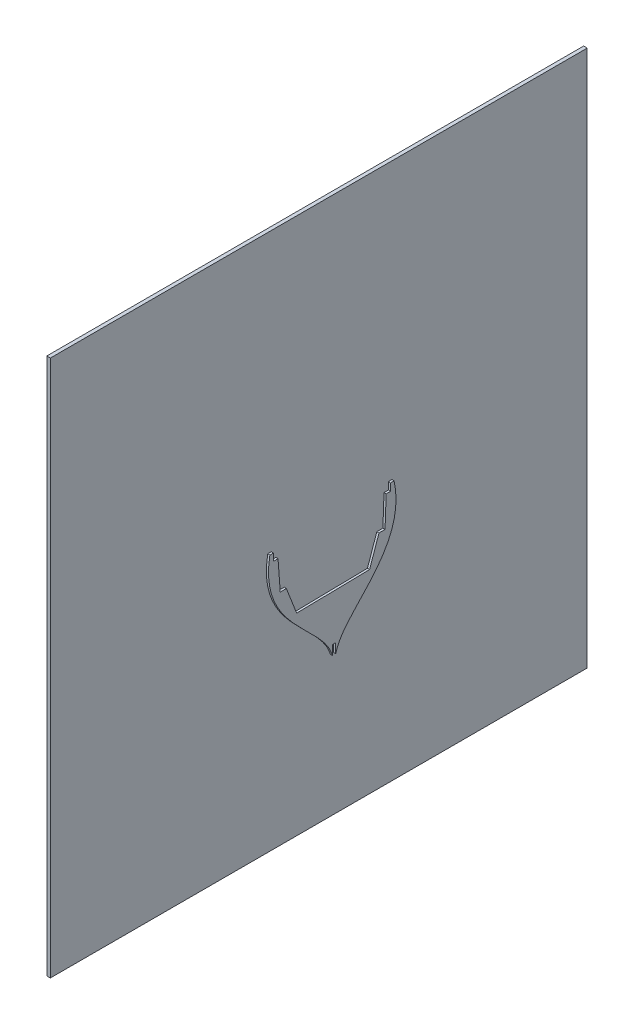
ISO-10303-21;
HEADER;
FILE_DESCRIPTION(('STEP AP214'),'2;1');
FILE_NAME('part.step','',(''),(''),'','','');
FILE_SCHEMA(('AUTOMOTIVE_DESIGN { 1 0 10303 214 1 1 1 1 }'));
ENDSEC;
DATA;
#1=APPLICATION_CONTEXT('core data for automotive mechanical design processes');
#2=APPLICATION_PROTOCOL_DEFINITION('international standard','automotive_design',2000,#1);
#3=PRODUCT_CONTEXT('',#1,'mechanical');
#4=PRODUCT('Part','Part','',(#3));
#5=PRODUCT_RELATED_PRODUCT_CATEGORY('part','',(#4));
#6=PRODUCT_DEFINITION_FORMATION('','',#4);
#7=PRODUCT_DEFINITION_CONTEXT('part definition',#1,'design');
#8=PRODUCT_DEFINITION('design','',#6,#7);
#9=PRODUCT_DEFINITION_SHAPE('','',#8);
#10=(LENGTH_UNIT() NAMED_UNIT(*) SI_UNIT(.MILLI.,.METRE.));
#11=(NAMED_UNIT(*) PLANE_ANGLE_UNIT() SI_UNIT($,.RADIAN.));
#12=(NAMED_UNIT(*) SI_UNIT($,.STERADIAN.) SOLID_ANGLE_UNIT());
#13=UNCERTAINTY_MEASURE_WITH_UNIT(LENGTH_MEASURE(1.E-05),#10,'distance_accuracy_value','');
#14=(GEOMETRIC_REPRESENTATION_CONTEXT(3) GLOBAL_UNCERTAINTY_ASSIGNED_CONTEXT((#13)) GLOBAL_UNIT_ASSIGNED_CONTEXT((#10,
#11,#12)) REPRESENTATION_CONTEXT('',''));
#15=CARTESIAN_POINT('',(0.,0.,0.));
#16=DIRECTION('',(0.,0.,1.));
#17=DIRECTION('',(1.,0.,0.));
#18=AXIS2_PLACEMENT_3D('',#15,#16,#17);
#19=CARTESIAN_POINT('',(6.,353.882778789468,179.975141307464));
#20=CARTESIAN_POINT('',(6.,157.878809233988,215.65519076964));
#21=CARTESIAN_POINT('',(6.,109.306012211339,12.0353677189194));
#22=CARTESIAN_POINT('',(6.,40.5531950083468,7.26042253036738));
#23=CARTESIAN_POINT('',(6.,0.,0.));
#24=B_SPLINE_CURVE_WITH_KNOTS('',4,(#19,#20,#21,#22,#23),.UNSPECIFIED.,.F.,.F.,(5,5),(0.,1.),.UNSPECIFIED.);
#25=DIRECTION('',(-1.,0.,0.));
#26=VECTOR('',#25,1.);
#27=SURFACE_OF_LINEAR_EXTRUSION('',#24,#26);
#28=CARTESIAN_POINT('',(0.,353.882778789468,179.975141307464));
#29=CARTESIAN_POINT('',(0.,157.878809233988,215.65519076964));
#30=CARTESIAN_POINT('',(0.,109.306012211339,12.0353677189194));
#31=CARTESIAN_POINT('',(0.,40.5531950083468,7.26042253036738));
#32=CARTESIAN_POINT('',(0.,0.,0.));
#33=B_SPLINE_CURVE_WITH_KNOTS('',4,(#28,#29,#30,#31,#32),.UNSPECIFIED.,.F.,.F.,(5,5),(0.,1.),.UNSPECIFIED.);
#34=CARTESIAN_POINT('',(0.,353.882778789468,179.975141307464));
#35=VERTEX_POINT('',#34);
#36=CARTESIAN_POINT('',(0.,22.9431478188066,4.91710052919201));
#37=VERTEX_POINT('',#36);
#38=EDGE_CURVE('E192',#35,#37,#33,.T.);
#39=ORIENTED_EDGE('',*,*,#38,.T.);
#40=DIRECTION('',(1.,0.,0.));
#41=VECTOR('',#40,1.);
#42=CARTESIAN_POINT('',(0.,22.9431478188066,4.91710052919201));
#43=LINE('',#42,#41);
#44=CARTESIAN_POINT('',(6.,22.9431478188066,4.91710052919201));
#45=VERTEX_POINT('',#44);
#46=EDGE_CURVE('E198',#37,#45,#43,.T.);
#47=ORIENTED_EDGE('',*,*,#46,.T.);
#48=CARTESIAN_POINT('',(6.,353.882778789468,179.975141307464));
#49=VERTEX_POINT('',#48);
#50=EDGE_CURVE('E232',#49,#45,#24,.T.);
#51=ORIENTED_EDGE('',*,*,#50,.F.);
#52=DIRECTION('',(-1.,0.,0.));
#53=VECTOR('',#52,1.);
#54=CARTESIAN_POINT('',(6.,353.882778789468,179.975141307464));
#55=LINE('',#54,#53);
#56=EDGE_CURVE('E188',#49,#35,#55,.T.);
#57=ORIENTED_EDGE('',*,*,#56,.T.);
#58=EDGE_LOOP('',(#39,#47,#51,#57));
#59=FACE_BOUND('',#58,.T.);
#60=ADVANCED_FACE('F45',(#59),#27,.F.);
#61=CARTESIAN_POINT('',(6.,0.,0.));
#62=CARTESIAN_POINT('',(6.,40.7895515982631,-5.78686798856676));
#63=CARTESIAN_POINT('',(6.,109.670201920761,-8.06853098987226));
#64=CARTESIAN_POINT('',(6.,165.586009065456,-209.795503557171));
#65=CARTESIAN_POINT('',(6.,360.169085770446,-167.039822400762));
#66=B_SPLINE_CURVE_WITH_KNOTS('',4,(#61,#62,#63,#64,#65),.UNSPECIFIED.,.F.,.F.,(5,5),(0.,1.),.UNSPECIFIED.);
#67=DIRECTION('',(-1.,0.,0.));
#68=VECTOR('',#67,1.);
#69=SURFACE_OF_LINEAR_EXTRUSION('',#66,#68);
#70=CARTESIAN_POINT('',(6.,23.1061862141087,-4.08289947080799));
#71=VERTEX_POINT('',#70);
#72=CARTESIAN_POINT('',(6.,360.169085770446,-167.039822400762));
#73=VERTEX_POINT('',#72);
#74=EDGE_CURVE('E128',#71,#73,#66,.T.);
#75=ORIENTED_EDGE('',*,*,#74,.F.);
#76=DIRECTION('',(1.,0.,0.));
#77=VECTOR('',#76,1.);
#78=CARTESIAN_POINT('',(0.,23.1061862141087,-4.08289947080799));
#79=LINE('',#78,#77);
#80=CARTESIAN_POINT('',(0.,23.1061862141087,-4.08289947080799));
#81=VERTEX_POINT('',#80);
#82=EDGE_CURVE('E322',#81,#71,#79,.T.);
#83=ORIENTED_EDGE('',*,*,#82,.F.);
#84=CARTESIAN_POINT('',(0.,0.,0.));
#85=CARTESIAN_POINT('',(0.,40.7895515982631,-5.78686798856676));
#86=CARTESIAN_POINT('',(0.,109.670201920761,-8.06853098987226));
#87=CARTESIAN_POINT('',(0.,165.586009065456,-209.795503557171));
#88=CARTESIAN_POINT('',(0.,360.169085770446,-167.039822400762));
#89=B_SPLINE_CURVE_WITH_KNOTS('',4,(#84,#85,#86,#87,#88),.UNSPECIFIED.,.F.,.F.,(5,5),(0.,1.),.UNSPECIFIED.);
#90=CARTESIAN_POINT('',(0.,360.169085770446,-167.039822400762));
#91=VERTEX_POINT('',#90);
#92=EDGE_CURVE('E197',#81,#91,#89,.T.);
#93=ORIENTED_EDGE('',*,*,#92,.T.);
#94=DIRECTION('',(-1.,0.,0.));
#95=VECTOR('',#94,1.);
#96=CARTESIAN_POINT('',(6.,360.169085770446,-167.039822400762));
#97=LINE('',#96,#95);
#98=EDGE_CURVE('E13',#73,#91,#97,.T.);
#99=ORIENTED_EDGE('',*,*,#98,.F.);
#100=EDGE_LOOP('',(#75,#83,#93,#99));
#101=FACE_BOUND('',#100,.T.);
#102=ADVANCED_FACE('F334',(#101),#69,.F.);
#103=CARTESIAN_POINT('',(6.,360.169085770446,-167.039822400762));
#104=DIRECTION('',(0.,-0.999835956927465,-0.0181124055536444));
#105=DIRECTION('',(0.,0.0181124055536444,-0.999835956927465));
#106=AXIS2_PLACEMENT_3D('',#103,#104,#105);
#107=PLANE('',#106);
#108=DIRECTION('',(0.,-0.0181124055536444,0.999835956927465));
#109=VECTOR('',#108,1.);
#110=CARTESIAN_POINT('',(0.,360.169085770446,-167.039822400762));
#111=LINE('',#110,#109);
#112=CARTESIAN_POINT('',(0.,359.987931997888,-157.039822400762));
#113=VERTEX_POINT('',#112);
#114=EDGE_CURVE('E205',#91,#113,#111,.T.);
#115=ORIENTED_EDGE('',*,*,#114,.T.);
#116=DIRECTION('',(-1.,0.,0.));
#117=VECTOR('',#116,1.);
#118=CARTESIAN_POINT('',(6.,359.987931997888,-157.039822400762));
#119=LINE('',#118,#117);
#120=CARTESIAN_POINT('',(6.,359.987931997888,-157.039822400762));
#121=VERTEX_POINT('',#120);
#122=EDGE_CURVE('E53',#121,#113,#119,.T.);
#123=ORIENTED_EDGE('',*,*,#122,.F.);
#124=DIRECTION('',(0.,-0.0181124055536444,0.999835956927465));
#125=VECTOR('',#124,1.);
#126=CARTESIAN_POINT('',(6.,360.169085770446,-167.039822400762));
#127=LINE('',#126,#125);
#128=EDGE_CURVE('E316',#73,#121,#127,.T.);
#129=ORIENTED_EDGE('',*,*,#128,.F.);
#130=ORIENTED_EDGE('',*,*,#98,.T.);
#131=EDGE_LOOP('',(#115,#123,#129,#130));
#132=FACE_BOUND('',#131,.T.);
#133=ADVANCED_FACE('F337',(#132),#107,.F.);
#134=CARTESIAN_POINT('',(6.,359.987931997888,-157.039822400762));
#135=DIRECTION('',(0.,0.0086060555721297,-0.999962967218031));
#136=DIRECTION('',(0.,0.999962967218031,0.0086060555721297));
#137=AXIS2_PLACEMENT_3D('',#134,#135,#136);
#138=PLANE('',#137);
#139=DIRECTION('',(0.,-0.999962967218031,-0.0086060555721297));
#140=VECTOR('',#139,1.);
#141=CARTESIAN_POINT('',(0.,359.987931997888,-157.039822400762));
#142=LINE('',#141,#140);
#143=CARTESIAN_POINT('',(0.,339.692478500137,-157.214492669951));
#144=VERTEX_POINT('',#143);
#145=EDGE_CURVE('E210',#113,#144,#142,.T.);
#146=ORIENTED_EDGE('',*,*,#145,.T.);
#147=DIRECTION('',(-1.,0.,0.));
#148=VECTOR('',#147,1.);
#149=CARTESIAN_POINT('',(6.,339.692478500137,-157.214492669951));
#150=LINE('',#149,#148);
#151=CARTESIAN_POINT('',(6.,339.692478500137,-157.214492669951));
#152=VERTEX_POINT('',#151);
#153=EDGE_CURVE('E257',#152,#144,#150,.T.);
#154=ORIENTED_EDGE('',*,*,#153,.F.);
#155=DIRECTION('',(0.,-0.999962967218031,-0.0086060555721297));
#156=VECTOR('',#155,1.);
#157=CARTESIAN_POINT('',(6.,359.987931997888,-157.039822400762));
#158=LINE('',#157,#156);
#159=EDGE_CURVE('E266',#121,#152,#158,.T.);
#160=ORIENTED_EDGE('',*,*,#159,.F.);
#161=ORIENTED_EDGE('',*,*,#122,.T.);
#162=EDGE_LOOP('',(#146,#154,#160,#161));
#163=FACE_BOUND('',#162,.T.);
#164=ADVANCED_FACE('F264',(#163),#138,.F.);
#165=CARTESIAN_POINT('',(6.,339.692478500137,-157.214492669951));
#166=DIRECTION('',(0.,-0.999835956927465,-0.0181124055536434));
#167=DIRECTION('',(0.,0.0181124055536434,-0.999835956927466));
#168=AXIS2_PLACEMENT_3D('',#165,#166,#167);
#169=PLANE('',#168);
#170=DIRECTION('',(0.,-0.0181124055536434,0.999835956927465));
#171=VECTOR('',#170,1.);
#172=CARTESIAN_POINT('',(0.,339.692478500137,-157.214492669951));
#173=LINE('',#172,#171);
#174=CARTESIAN_POINT('',(0.,339.469822373553,-144.923491304635));
#175=VERTEX_POINT('',#174);
#176=EDGE_CURVE('E212',#144,#175,#173,.T.);
#177=ORIENTED_EDGE('',*,*,#176,.T.);
#178=DIRECTION('',(-1.,0.,0.));
#179=VECTOR('',#178,1.);
#180=CARTESIAN_POINT('',(6.,339.469822373553,-144.923491304635));
#181=LINE('',#180,#179);
#182=CARTESIAN_POINT('',(6.,339.469822373553,-144.923491304635));
#183=VERTEX_POINT('',#182);
#184=EDGE_CURVE('E254',#183,#175,#181,.T.);
#185=ORIENTED_EDGE('',*,*,#184,.F.);
#186=DIRECTION('',(0.,-0.0181124055536434,0.999835956927465));
#187=VECTOR('',#186,1.);
#188=CARTESIAN_POINT('',(6.,339.692478500137,-157.214492669951));
#189=LINE('',#188,#187);
#190=EDGE_CURVE('E287',#152,#183,#189,.T.);
#191=ORIENTED_EDGE('',*,*,#190,.F.);
#192=ORIENTED_EDGE('',*,*,#153,.T.);
#193=EDGE_LOOP('',(#177,#185,#191,#192));
#194=FACE_BOUND('',#193,.T.);
#195=ADVANCED_FACE('F278',(#194),#169,.F.);
#196=CARTESIAN_POINT('',(6.,339.469822373553,-144.923491304635));
#197=DIRECTION('',(0.,-0.0367280694330064,-0.999325296845689));
#198=DIRECTION('',(0.,0.999325296845689,-0.0367280694330064));
#199=AXIS2_PLACEMENT_3D('',#196,#197,#198);
#200=PLANE('',#199);
#201=DIRECTION('',(0.,-0.999325296845689,0.0367280694330064));
#202=VECTOR('',#201,1.);
#203=CARTESIAN_POINT('',(0.,339.469822373553,-144.923491304635));
#204=LINE('',#203,#202);
#205=CARTESIAN_POINT('',(0.,255.190482282768,-141.825983952031));
#206=VERTEX_POINT('',#205);
#207=EDGE_CURVE('E214',#175,#206,#204,.T.);
#208=ORIENTED_EDGE('',*,*,#207,.T.);
#209=DIRECTION('',(-1.,0.,0.));
#210=VECTOR('',#209,1.);
#211=CARTESIAN_POINT('',(6.,255.190482282768,-141.825983952031));
#212=LINE('',#211,#210);
#213=CARTESIAN_POINT('',(6.,255.190482282768,-141.825983952031));
#214=VERTEX_POINT('',#213);
#215=EDGE_CURVE('E251',#214,#206,#212,.T.);
#216=ORIENTED_EDGE('',*,*,#215,.F.);
#217=DIRECTION('',(0.,-0.999325296845689,0.0367280694330064));
#218=VECTOR('',#217,1.);
#219=CARTESIAN_POINT('',(6.,339.469822373553,-144.923491304635));
#220=LINE('',#219,#218);
#221=EDGE_CURVE('E284',#183,#214,#220,.T.);
#222=ORIENTED_EDGE('',*,*,#221,.F.);
#223=ORIENTED_EDGE('',*,*,#184,.T.);
#224=EDGE_LOOP('',(#208,#216,#222,#223));
#225=FACE_BOUND('',#224,.T.);
#226=ADVANCED_FACE('F282',(#225),#200,.F.);
#227=CARTESIAN_POINT('',(6.,255.190482282768,-141.825983952031));
#228=DIRECTION('',(0.,-0.999835956927466,-0.0181124055536332));
#229=DIRECTION('',(0.,0.0181124055536332,-0.999835956927466));
#230=AXIS2_PLACEMENT_3D('',#227,#228,#229);
#231=PLANE('',#230);
#232=DIRECTION('',(0.,-0.0181124055536332,0.999835956927466));
#233=VECTOR('',#232,1.);
#234=CARTESIAN_POINT('',(0.,255.190482282768,-141.825983952031));
#235=LINE('',#234,#233);
#236=CARTESIAN_POINT('',(0.,254.88291202331,-124.847576319897));
#237=VERTEX_POINT('',#236);
#238=EDGE_CURVE('E216',#206,#237,#235,.T.);
#239=ORIENTED_EDGE('',*,*,#238,.T.);
#240=DIRECTION('',(-1.,0.,0.));
#241=VECTOR('',#240,1.);
#242=CARTESIAN_POINT('',(6.,254.88291202331,-124.847576319897));
#243=LINE('',#242,#241);
#244=CARTESIAN_POINT('',(6.,254.88291202331,-124.847576319897));
#245=VERTEX_POINT('',#244);
#246=EDGE_CURVE('E248',#245,#237,#243,.T.);
#247=ORIENTED_EDGE('',*,*,#246,.F.);
#248=DIRECTION('',(0.,-0.0181124055536332,0.999835956927466));
#249=VECTOR('',#248,1.);
#250=CARTESIAN_POINT('',(6.,255.190482282768,-141.825983952031));
#251=LINE('',#250,#249);
#252=EDGE_CURVE('E286',#214,#245,#251,.T.);
#253=ORIENTED_EDGE('',*,*,#252,.F.);
#254=ORIENTED_EDGE('',*,*,#215,.T.);
#255=EDGE_LOOP('',(#239,#247,#253,#254));
#256=FACE_BOUND('',#255,.T.);
#257=ADVANCED_FACE('F347',(#256),#231,.F.);
#258=CARTESIAN_POINT('',(6.,254.88291202331,-124.847576319897));
#259=DIRECTION('',(0.,-0.328369606899199,-0.944549311187545));
#260=DIRECTION('',(0.,0.944549311187545,-0.328369606899199));
#261=AXIS2_PLACEMENT_3D('',#258,#259,#260);
#262=PLANE('',#261);
#263=DIRECTION('',(0.,-0.944549311187545,0.328369606899199));
#264=VECTOR('',#263,1.);
#265=CARTESIAN_POINT('',(0.,254.88291202331,-124.847576319897));
#266=LINE('',#265,#264);
#267=CARTESIAN_POINT('',(0.,179.646068267811,-98.6917234536576));
#268=VERTEX_POINT('',#267);
#269=EDGE_CURVE('E218',#237,#268,#266,.T.);
#270=ORIENTED_EDGE('',*,*,#269,.T.);
#271=DIRECTION('',(-1.,0.,0.));
#272=VECTOR('',#271,1.);
#273=CARTESIAN_POINT('',(6.,179.646068267811,-98.6917234536576));
#274=LINE('',#273,#272);
#275=CARTESIAN_POINT('',(6.,179.646068267811,-98.6917234536576));
#276=VERTEX_POINT('',#275);
#277=EDGE_CURVE('E245',#276,#268,#274,.T.);
#278=ORIENTED_EDGE('',*,*,#277,.F.);
#279=DIRECTION('',(0.,-0.944549311187545,0.328369606899199));
#280=VECTOR('',#279,1.);
#281=CARTESIAN_POINT('',(6.,254.88291202331,-124.847576319897));
#282=LINE('',#281,#280);
#283=EDGE_CURVE('E289',#245,#276,#282,.T.);
#284=ORIENTED_EDGE('',*,*,#283,.F.);
#285=ORIENTED_EDGE('',*,*,#246,.T.);
#286=EDGE_LOOP('',(#270,#278,#284,#285));
#287=FACE_BOUND('',#286,.T.);
#288=ADVANCED_FACE('F350',(#287),#262,.F.);
#289=CARTESIAN_POINT('',(6.,179.646068267811,-98.6917234536576));
#290=DIRECTION('',(0.,-0.999835956927465,-0.0181124055536431));
#291=DIRECTION('',(0.,0.0181124055536431,-0.999835956927466));
#292=AXIS2_PLACEMENT_3D('',#289,#290,#291);
#293=PLANE('',#292);
#294=DIRECTION('',(0.,-0.0181124055536431,0.999835956927465));
#295=VECTOR('',#294,1.);
#296=CARTESIAN_POINT('',(0.,179.646068267811,-98.6917234536576));
#297=LINE('',#296,#295);
#298=CARTESIAN_POINT('',(0.,175.953696593009,105.133547346181));
#299=VERTEX_POINT('',#298);
#300=EDGE_CURVE('E220',#268,#299,#297,.T.);
#301=ORIENTED_EDGE('',*,*,#300,.T.);
#302=DIRECTION('',(-1.,0.,0.));
#303=VECTOR('',#302,1.);
#304=CARTESIAN_POINT('',(6.,175.953696593009,105.133547346181));
#305=LINE('',#304,#303);
#306=CARTESIAN_POINT('',(6.,175.953696593009,105.133547346181));
#307=VERTEX_POINT('',#306);
#308=EDGE_CURVE('E242',#307,#299,#305,.T.);
#309=ORIENTED_EDGE('',*,*,#308,.F.);
#310=DIRECTION('',(0.,-0.0181124055536431,0.999835956927465));
#311=VECTOR('',#310,1.);
#312=CARTESIAN_POINT('',(6.,179.646068267811,-98.6917234536576));
#313=LINE('',#312,#311);
#314=EDGE_CURVE('E295',#276,#307,#313,.T.);
#315=ORIENTED_EDGE('',*,*,#314,.F.);
#316=ORIENTED_EDGE('',*,*,#277,.T.);
#317=EDGE_LOOP('',(#301,#309,#315,#316));
#318=FACE_BOUND('',#317,.T.);
#319=ADVANCED_FACE('F354',(#318),#293,.F.);
#320=CARTESIAN_POINT('',(6.,250.193840665581,133.997232237985));
#321=DIRECTION('',(0.,-0.362364664996936,0.932036399268643));
#322=DIRECTION('',(0.,-0.932036399268644,-0.362364664996936));
#323=AXIS2_PLACEMENT_3D('',#320,#321,#322);
#324=PLANE('',#323);
#325=DIRECTION('',(0.,0.932036399268643,0.362364664996936));
#326=VECTOR('',#325,1.);
#327=CARTESIAN_POINT('',(0.,250.193840665581,133.997232237985));
#328=LINE('',#327,#326);
#329=CARTESIAN_POINT('',(0.,250.193840665581,133.997232237985));
#330=VERTEX_POINT('',#329);
#331=EDGE_CURVE('E222',#299,#330,#328,.T.);
#332=ORIENTED_EDGE('',*,*,#331,.T.);
#333=DIRECTION('',(-1.,0.,0.));
#334=VECTOR('',#333,1.);
#335=CARTESIAN_POINT('',(6.,250.193840665581,133.997232237985));
#336=LINE('',#335,#334);
#337=CARTESIAN_POINT('',(6.,250.193840665581,133.997232237985));
#338=VERTEX_POINT('',#337);
#339=EDGE_CURVE('E239',#338,#330,#336,.T.);
#340=ORIENTED_EDGE('',*,*,#339,.F.);
#341=DIRECTION('',(0.,0.932036399268643,0.362364664996936));
#342=VECTOR('',#341,1.);
#343=CARTESIAN_POINT('',(6.,250.193840665581,133.997232237985));
#344=LINE('',#343,#342);
#345=EDGE_CURVE('E297',#307,#338,#344,.T.);
#346=ORIENTED_EDGE('',*,*,#345,.F.);
#347=ORIENTED_EDGE('',*,*,#308,.T.);
#348=EDGE_LOOP('',(#332,#340,#346,#347));
#349=FACE_BOUND('',#348,.T.);
#350=ADVANCED_FACE('F358',(#349),#324,.F.);
#351=CARTESIAN_POINT('',(6.,249.886270406123,150.975639870119));
#352=DIRECTION('',(0.,-0.999835956927465,-0.0181124055536447));
#353=DIRECTION('',(0.,0.0181124055536447,-0.999835956927465));
#354=AXIS2_PLACEMENT_3D('',#351,#352,#353);
#355=PLANE('',#354);
#356=DIRECTION('',(0.,-0.0181124055536447,0.999835956927465));
#357=VECTOR('',#356,1.);
#358=CARTESIAN_POINT('',(0.,249.886270406123,150.975639870119));
#359=LINE('',#358,#357);
#360=CARTESIAN_POINT('',(0.,249.886270406123,150.975639870119));
#361=VERTEX_POINT('',#360);
#362=EDGE_CURVE('E224',#330,#361,#359,.T.);
#363=ORIENTED_EDGE('',*,*,#362,.T.);
#364=DIRECTION('',(-1.,0.,0.));
#365=VECTOR('',#364,1.);
#366=CARTESIAN_POINT('',(6.,249.886270406123,150.975639870119));
#367=LINE('',#366,#365);
#368=CARTESIAN_POINT('',(6.,249.886270406123,150.975639870119));
#369=VERTEX_POINT('',#368);
#370=EDGE_CURVE('E236',#369,#361,#367,.T.);
#371=ORIENTED_EDGE('',*,*,#370,.F.);
#372=DIRECTION('',(0.,-0.0181124055536447,0.999835956927465));
#373=VECTOR('',#372,1.);
#374=CARTESIAN_POINT('',(6.,249.886270406123,150.975639870119));
#375=LINE('',#374,#373);
#376=EDGE_CURVE('E299',#338,#369,#375,.T.);
#377=ORIENTED_EDGE('',*,*,#376,.F.);
#378=ORIENTED_EDGE('',*,*,#339,.T.);
#379=EDGE_LOOP('',(#363,#371,#377,#378));
#380=FACE_BOUND('',#379,.T.);
#381=ADVANCED_FACE('F305',(#380),#355,.F.);
#382=CARTESIAN_POINT('',(6.,333.998125053212,157.123617241952));
#383=DIRECTION('',(0.,-0.0728984031613152,0.997339371937421));
#384=DIRECTION('',(0.,-0.997339371937422,-0.0728984031613152));
#385=AXIS2_PLACEMENT_3D('',#382,#383,#384);
#386=PLANE('',#385);
#387=DIRECTION('',(0.,0.997339371937422,0.0728984031613152));
#388=VECTOR('',#387,1.);
#389=CARTESIAN_POINT('',(0.,333.998125053212,157.123617241952));
#390=LINE('',#389,#388);
#391=CARTESIAN_POINT('',(0.,333.998125053212,157.123617241952));
#392=VERTEX_POINT('',#391);
#393=EDGE_CURVE('E226',#361,#392,#390,.T.);
#394=ORIENTED_EDGE('',*,*,#393,.T.);
#395=DIRECTION('',(-1.,0.,0.));
#396=VECTOR('',#395,1.);
#397=CARTESIAN_POINT('',(6.,333.998125053212,157.123617241952));
#398=LINE('',#397,#396);
#399=CARTESIAN_POINT('',(6.,333.998125053212,157.123617241952));
#400=VERTEX_POINT('',#399);
#401=EDGE_CURVE('E183',#400,#392,#398,.T.);
#402=ORIENTED_EDGE('',*,*,#401,.F.);
#403=DIRECTION('',(0.,0.997339371937422,0.0728984031613152));
#404=VECTOR('',#403,1.);
#405=CARTESIAN_POINT('',(6.,333.998125053212,157.123617241952));
#406=LINE('',#405,#404);
#407=EDGE_CURVE('E171',#369,#400,#406,.T.);
#408=ORIENTED_EDGE('',*,*,#407,.F.);
#409=ORIENTED_EDGE('',*,*,#370,.T.);
#410=EDGE_LOOP('',(#394,#402,#408,#409));
#411=FACE_BOUND('',#410,.T.);
#412=ADVANCED_FACE('F309',(#411),#386,.F.);
#413=CARTESIAN_POINT('',(6.,333.775468926628,169.414618607268));
#414=DIRECTION('',(0.,-0.999835956927465,-0.0181124055536433));
#415=DIRECTION('',(0.,0.0181124055536433,-0.999835956927466));
#416=AXIS2_PLACEMENT_3D('',#413,#414,#415);
#417=PLANE('',#416);
#418=DIRECTION('',(0.,-0.0181124055536433,0.999835956927465));
#419=VECTOR('',#418,1.);
#420=CARTESIAN_POINT('',(0.,333.775468926628,169.414618607268));
#421=LINE('',#420,#419);
#422=CARTESIAN_POINT('',(0.,333.775468926628,169.414618607268));
#423=VERTEX_POINT('',#422);
#424=EDGE_CURVE('E180',#392,#423,#421,.T.);
#425=ORIENTED_EDGE('',*,*,#424,.T.);
#426=DIRECTION('',(-1.,0.,0.));
#427=VECTOR('',#426,1.);
#428=CARTESIAN_POINT('',(6.,333.775468926628,169.414618607268));
#429=LINE('',#428,#427);
#430=CARTESIAN_POINT('',(6.,333.775468926628,169.414618607268));
#431=VERTEX_POINT('',#430);
#432=EDGE_CURVE('E177',#431,#423,#429,.T.);
#433=ORIENTED_EDGE('',*,*,#432,.F.);
#434=DIRECTION('',(0.,-0.0181124055536433,0.999835956927465));
#435=VECTOR('',#434,1.);
#436=CARTESIAN_POINT('',(6.,333.775468926628,169.414618607268));
#437=LINE('',#436,#435);
#438=EDGE_CURVE('E163',#400,#431,#437,.T.);
#439=ORIENTED_EDGE('',*,*,#438,.F.);
#440=ORIENTED_EDGE('',*,*,#401,.T.);
#441=EDGE_LOOP('',(#425,#433,#439,#440));
#442=FACE_BOUND('',#441,.T.);
#443=ADVANCED_FACE('F178',(#442),#417,.F.);
#444=CARTESIAN_POINT('',(6.,354.063932562026,169.975141307464));
#445=DIRECTION('',(0.,-0.0276171184123859,0.999618574642646));
#446=DIRECTION('',(0.,-0.999618574642647,-0.0276171184123859));
#447=AXIS2_PLACEMENT_3D('',#444,#445,#446);
#448=PLANE('',#447);
#449=DIRECTION('',(0.,0.999618574642646,0.0276171184123859));
#450=VECTOR('',#449,1.);
#451=CARTESIAN_POINT('',(0.,354.063932562026,169.975141307464));
#452=LINE('',#451,#450);
#453=CARTESIAN_POINT('',(0.,354.063932562026,169.975141307464));
#454=VERTEX_POINT('',#453);
#455=EDGE_CURVE('E229',#423,#454,#452,.T.);
#456=ORIENTED_EDGE('',*,*,#455,.T.);
#457=DIRECTION('',(-1.,0.,0.));
#458=VECTOR('',#457,1.);
#459=CARTESIAN_POINT('',(6.,354.063932562026,169.975141307464));
#460=LINE('',#459,#458);
#461=CARTESIAN_POINT('',(6.,354.063932562026,169.975141307464));
#462=VERTEX_POINT('',#461);
#463=EDGE_CURVE('E184',#462,#454,#460,.T.);
#464=ORIENTED_EDGE('',*,*,#463,.F.);
#465=DIRECTION('',(0.,0.999618574642646,0.0276171184123859));
#466=VECTOR('',#465,1.);
#467=CARTESIAN_POINT('',(6.,354.063932562026,169.975141307464));
#468=LINE('',#467,#466);
#469=EDGE_CURVE('E168',#431,#462,#468,.T.);
#470=ORIENTED_EDGE('',*,*,#469,.F.);
#471=ORIENTED_EDGE('',*,*,#432,.T.);
#472=EDGE_LOOP('',(#456,#464,#470,#471));
#473=FACE_BOUND('',#472,.T.);
#474=ADVANCED_FACE('F186',(#473),#448,.F.);
#475=CARTESIAN_POINT('',(6.,353.882778789468,179.975141307464));
#476=DIRECTION('',(0.,-0.999835956927465,-0.0181124055536444));
#477=DIRECTION('',(0.,0.0181124055536444,-0.999835956927465));
#478=AXIS2_PLACEMENT_3D('',#475,#476,#477);
#479=PLANE('',#478);
#480=DIRECTION('',(0.,-0.0181124055536444,0.999835956927465));
#481=VECTOR('',#480,1.);
#482=CARTESIAN_POINT('',(0.,353.882778789468,179.975141307464));
#483=LINE('',#482,#481);
#484=EDGE_CURVE('E120',#454,#35,#483,.T.);
#485=ORIENTED_EDGE('',*,*,#484,.T.);
#486=ORIENTED_EDGE('',*,*,#56,.F.);
#487=DIRECTION('',(0.,-0.0181124055536444,0.999835956927465));
#488=VECTOR('',#487,1.);
#489=CARTESIAN_POINT('',(6.,353.882778789468,179.975141307464));
#490=LINE('',#489,#488);
#491=EDGE_CURVE('E69',#462,#49,#490,.T.);
#492=ORIENTED_EDGE('',*,*,#491,.F.);
#493=ORIENTED_EDGE('',*,*,#463,.T.);
#494=EDGE_LOOP('',(#485,#486,#492,#493));
#495=FACE_BOUND('',#494,.T.);
#496=ADVANCED_FACE('F311',(#495),#479,.F.);
#497=CARTESIAN_POINT('',(6.,112.715429314178,71.4906125513132));
#498=DIRECTION('',(1.,0.,0.));
#499=DIRECTION('',(0.,0.,-1.));
#500=AXIS2_PLACEMENT_3D('',#497,#498,#499);
#501=PLANE('',#500);
#502=DIRECTION('',(0.,-0.999835956927465,-0.0181124055536429));
#503=VECTOR('',#502,1.);
#504=CARTESIAN_POINT('',(6.,22.9431478188066,4.91710052919201));
#505=LINE('',#504,#503);
#506=CARTESIAN_POINT('',(6.,49.9431478188066,5.40621571509829));
#507=VERTEX_POINT('',#506);
#508=EDGE_CURVE('E510',#507,#45,#505,.T.);
#509=ORIENTED_EDGE('',*,*,#508,.F.);
#510=DIRECTION('',(0.,-0.0181124055536438,0.999835956927465));
#511=VECTOR('',#510,1.);
#512=CARTESIAN_POINT('',(6.,49.9431478188066,5.40621571509829));
#513=LINE('',#512,#511);
#514=CARTESIAN_POINT('',(6.,50.1061862141087,-3.59378428490171));
#515=VERTEX_POINT('',#514);
#516=EDGE_CURVE('E519',#515,#507,#513,.T.);
#517=ORIENTED_EDGE('',*,*,#516,.F.);
#518=DIRECTION('',(0.,0.999835956927465,0.0181124055536428));
#519=VECTOR('',#518,1.);
#520=CARTESIAN_POINT('',(6.,50.1061862141087,-3.59378428490171));
#521=LINE('',#520,#519);
#522=EDGE_CURVE('E523',#71,#515,#521,.T.);
#523=ORIENTED_EDGE('',*,*,#522,.F.);
#524=ORIENTED_EDGE('',*,*,#74,.T.);
#525=ORIENTED_EDGE('',*,*,#128,.T.);
#526=ORIENTED_EDGE('',*,*,#159,.T.);
#527=ORIENTED_EDGE('',*,*,#190,.T.);
#528=ORIENTED_EDGE('',*,*,#221,.T.);
#529=ORIENTED_EDGE('',*,*,#252,.T.);
#530=ORIENTED_EDGE('',*,*,#283,.T.);
#531=ORIENTED_EDGE('',*,*,#314,.T.);
#532=ORIENTED_EDGE('',*,*,#345,.T.);
#533=ORIENTED_EDGE('',*,*,#376,.T.);
#534=ORIENTED_EDGE('',*,*,#407,.T.);
#535=ORIENTED_EDGE('',*,*,#438,.T.);
#536=ORIENTED_EDGE('',*,*,#469,.T.);
#537=ORIENTED_EDGE('',*,*,#491,.T.);
#538=ORIENTED_EDGE('',*,*,#50,.T.);
#539=EDGE_LOOP('',(#509,#517,#523,#524,#525,#526,#527,#528,#529,#530,#531,#532,#533,#534,#535,
#536,#537,#538));
#540=FACE_BOUND('',#539,.T.);
#541=ADVANCED_FACE('F166',(#540),#501,.T.);
#542=CARTESIAN_POINT('',(0.,112.715429314178,71.4906125513132));
#543=DIRECTION('',(1.,0.,0.));
#544=DIRECTION('',(0.,0.,-1.));
#545=AXIS2_PLACEMENT_3D('',#542,#543,#544);
#546=PLANE('',#545);
#547=DIRECTION('',(0.,-0.0181124055536438,0.999835956927465));
#548=VECTOR('',#547,1.);
#549=CARTESIAN_POINT('',(0.,49.9431478188066,5.40621571509829));
#550=LINE('',#549,#548);
#551=CARTESIAN_POINT('',(0.,50.1061862141087,-3.59378428490172));
#552=VERTEX_POINT('',#551);
#553=CARTESIAN_POINT('',(0.,49.9431478188066,5.40621571509829));
#554=VERTEX_POINT('',#553);
#555=EDGE_CURVE('E60',#552,#554,#550,.T.);
#556=ORIENTED_EDGE('',*,*,#555,.T.);
#557=DIRECTION('',(0.,-0.999835956927465,-0.0181124055536429));
#558=VECTOR('',#557,1.);
#559=CARTESIAN_POINT('',(0.,22.9431478188066,4.91710052919201));
#560=LINE('',#559,#558);
#561=EDGE_CURVE('E532',#554,#37,#560,.T.);
#562=ORIENTED_EDGE('',*,*,#561,.T.);
#563=ORIENTED_EDGE('',*,*,#38,.F.);
#564=ORIENTED_EDGE('',*,*,#484,.F.);
#565=ORIENTED_EDGE('',*,*,#455,.F.);
#566=ORIENTED_EDGE('',*,*,#424,.F.);
#567=ORIENTED_EDGE('',*,*,#393,.F.);
#568=ORIENTED_EDGE('',*,*,#362,.F.);
#569=ORIENTED_EDGE('',*,*,#331,.F.);
#570=ORIENTED_EDGE('',*,*,#300,.F.);
#571=ORIENTED_EDGE('',*,*,#269,.F.);
#572=ORIENTED_EDGE('',*,*,#238,.F.);
#573=ORIENTED_EDGE('',*,*,#207,.F.);
#574=ORIENTED_EDGE('',*,*,#176,.F.);
#575=ORIENTED_EDGE('',*,*,#145,.F.);
#576=ORIENTED_EDGE('',*,*,#114,.F.);
#577=ORIENTED_EDGE('',*,*,#92,.F.);
#578=DIRECTION('',(0.,0.999835956927465,0.0181124055536428));
#579=VECTOR('',#578,1.);
#580=CARTESIAN_POINT('',(0.,50.1061862141087,-3.59378428490171));
#581=LINE('',#580,#579);
#582=EDGE_CURVE('E518',#81,#552,#581,.T.);
#583=ORIENTED_EDGE('',*,*,#582,.T.);
#584=EDGE_LOOP('',(#556,#562,#563,#564,#565,#566,#567,#568,#569,#570,#571,#572,#573,#574,#575,
#576,#577,#583));
#585=FACE_BOUND('',#584,.T.);
#586=ADVANCED_FACE('F272',(#585),#546,.F.);
#587=CARTESIAN_POINT('',(0.,22.9431478188066,4.91710052919201));
#588=DIRECTION('',(0.,-0.0181124055536429,0.999835956927465));
#589=DIRECTION('',(0.,-0.999835956927466,-0.0181124055536429));
#590=AXIS2_PLACEMENT_3D('',#587,#588,#589);
#591=PLANE('',#590);
#592=ORIENTED_EDGE('',*,*,#508,.T.);
#593=ORIENTED_EDGE('',*,*,#46,.F.);
#594=ORIENTED_EDGE('',*,*,#561,.F.);
#595=DIRECTION('',(1.,0.,0.));
#596=VECTOR('',#595,1.);
#597=CARTESIAN_POINT('',(0.,49.9431478188066,5.40621571509829));
#598=LINE('',#597,#596);
#599=EDGE_CURVE('E514',#554,#507,#598,.T.);
#600=ORIENTED_EDGE('',*,*,#599,.T.);
#601=EDGE_LOOP('',(#592,#593,#594,#600));
#602=FACE_BOUND('',#601,.T.);
#603=ADVANCED_FACE('F375',(#602),#591,.F.);
#604=CARTESIAN_POINT('',(0.,49.9431478188066,5.40621571509829));
#605=DIRECTION('',(0.,0.999835956927465,0.0181124055536438));
#606=DIRECTION('',(0.,-0.0181124055536438,0.999835956927466));
#607=AXIS2_PLACEMENT_3D('',#604,#605,#606);
#608=PLANE('',#607);
#609=ORIENTED_EDGE('',*,*,#516,.T.);
#610=ORIENTED_EDGE('',*,*,#599,.F.);
#611=ORIENTED_EDGE('',*,*,#555,.F.);
#612=DIRECTION('',(1.,0.,0.));
#613=VECTOR('',#612,1.);
#614=CARTESIAN_POINT('',(0.,50.1061862141087,-3.59378428490171));
#615=LINE('',#614,#613);
#616=EDGE_CURVE('E528',#552,#515,#615,.T.);
#617=ORIENTED_EDGE('',*,*,#616,.T.);
#618=EDGE_LOOP('',(#609,#610,#611,#617));
#619=FACE_BOUND('',#618,.T.);
#620=ADVANCED_FACE('F381',(#619),#608,.F.);
#621=CARTESIAN_POINT('',(0.,50.1061862141087,-3.59378428490171));
#622=DIRECTION('',(0.,0.0181124055536428,-0.999835956927465));
#623=DIRECTION('',(0.,0.999835956927466,0.0181124055536428));
#624=AXIS2_PLACEMENT_3D('',#621,#622,#623);
#625=PLANE('',#624);
#626=ORIENTED_EDGE('',*,*,#522,.T.);
#627=ORIENTED_EDGE('',*,*,#616,.F.);
#628=ORIENTED_EDGE('',*,*,#582,.F.);
#629=ORIENTED_EDGE('',*,*,#82,.T.);
#630=EDGE_LOOP('',(#626,#627,#628,#629));
#631=FACE_BOUND('',#630,.T.);
#632=ADVANCED_FACE('F378',(#631),#625,.F.);
#633=CLOSED_SHELL('',(#60,#102,#133,#164,#195,#226,#257,#288,#319,#350,#381,#412,#443,#474,#496,
#541,#586,#603,#620,#632));
#634=MANIFOLD_SOLID_BREP('B2',#633);
#635=CARTESIAN_POINT('',(-10.,0.,0.));
#636=DIRECTION('',(-1.,0.,0.));
#637=DIRECTION('',(0.,0.,1.));
#638=AXIS2_PLACEMENT_3D('',#635,#636,#637);
#639=PLANE('',#638);
#640=DIRECTION('',(0.,0.,-1.));
#641=VECTOR('',#640,1.);
#642=CARTESIAN_POINT('',(-10.,-378.710653275796,777.274991403029));
#643=LINE('',#642,#641);
#644=CARTESIAN_POINT('',(-10.,-378.710653275796,777.274991403029));
#645=VERTEX_POINT('',#644);
#646=CARTESIAN_POINT('',(-10.,-378.710653275796,-722.725008596971));
#647=VERTEX_POINT('',#646);
#648=EDGE_CURVE('E563',#645,#647,#643,.T.);
#649=ORIENTED_EDGE('',*,*,#648,.T.);
#650=DIRECTION('',(0.,-1.,0.));
#651=VECTOR('',#650,1.);
#652=CARTESIAN_POINT('',(-10.,1121.2893467242,-722.725008596971));
#653=LINE('',#652,#651);
#654=CARTESIAN_POINT('',(-10.,1121.2893467242,-722.725008596971));
#655=VERTEX_POINT('',#654);
#656=EDGE_CURVE('E597',#655,#647,#653,.T.);
#657=ORIENTED_EDGE('',*,*,#656,.F.);
#658=DIRECTION('',(0.,0.,-1.));
#659=VECTOR('',#658,1.);
#660=CARTESIAN_POINT('',(-10.,1121.2893467242,777.274991403029));
#661=LINE('',#660,#659);
#662=CARTESIAN_POINT('',(-10.,1121.2893467242,777.274991403029));
#663=VERTEX_POINT('',#662);
#664=EDGE_CURVE('E594',#663,#655,#661,.T.);
#665=ORIENTED_EDGE('',*,*,#664,.F.);
#666=DIRECTION('',(0.,-1.,0.));
#667=VECTOR('',#666,1.);
#668=CARTESIAN_POINT('',(-10.,1121.2893467242,777.274991403029));
#669=LINE('',#668,#667);
#670=EDGE_CURVE('E591',#663,#645,#669,.T.);
#671=ORIENTED_EDGE('',*,*,#670,.T.);
#672=EDGE_LOOP('',(#649,#657,#665,#671));
#673=FACE_BOUND('',#672,.T.);
#674=ADVANCED_FACE('F554',(#673),#639,.F.);
#675=CARTESIAN_POINT('',(-20.,0.,0.));
#676=DIRECTION('',(-1.,0.,0.));
#677=DIRECTION('',(0.,0.,1.));
#678=AXIS2_PLACEMENT_3D('',#675,#676,#677);
#679=PLANE('',#678);
#680=DIRECTION('',(0.,0.,-1.));
#681=VECTOR('',#680,1.);
#682=CARTESIAN_POINT('',(-20.,-378.710653275796,777.274991403029));
#683=LINE('',#682,#681);
#684=CARTESIAN_POINT('',(-20.,-378.710653275796,777.274991403029));
#685=VERTEX_POINT('',#684);
#686=CARTESIAN_POINT('',(-20.,-378.710653275796,-722.725008596971));
#687=VERTEX_POINT('',#686);
#688=EDGE_CURVE('E43',#685,#687,#683,.T.);
#689=ORIENTED_EDGE('',*,*,#688,.F.);
#690=DIRECTION('',(0.,-1.,0.));
#691=VECTOR('',#690,1.);
#692=CARTESIAN_POINT('',(-20.,1121.2893467242,777.274991403029));
#693=LINE('',#692,#691);
#694=CARTESIAN_POINT('',(-20.,1121.2893467242,777.274991403029));
#695=VERTEX_POINT('',#694);
#696=EDGE_CURVE('E610',#695,#685,#693,.T.);
#697=ORIENTED_EDGE('',*,*,#696,.F.);
#698=DIRECTION('',(0.,0.,-1.));
#699=VECTOR('',#698,1.);
#700=CARTESIAN_POINT('',(-20.,1121.2893467242,777.274991403029));
#701=LINE('',#700,#699);
#702=CARTESIAN_POINT('',(-20.,1121.2893467242,-722.725008596971));
#703=VERTEX_POINT('',#702);
#704=EDGE_CURVE('E601',#695,#703,#701,.T.);
#705=ORIENTED_EDGE('',*,*,#704,.T.);
#706=DIRECTION('',(0.,-1.,0.));
#707=VECTOR('',#706,1.);
#708=CARTESIAN_POINT('',(-20.,1121.2893467242,-722.725008596971));
#709=LINE('',#708,#707);
#710=EDGE_CURVE('E572',#703,#687,#709,.T.);
#711=ORIENTED_EDGE('',*,*,#710,.T.);
#712=EDGE_LOOP('',(#689,#697,#705,#711));
#713=FACE_BOUND('',#712,.T.);
#714=ADVANCED_FACE('F650',(#713),#679,.T.);
#715=CARTESIAN_POINT('',(-20.,1121.2893467242,777.274991403029));
#716=DIRECTION('',(0.,0.,1.));
#717=DIRECTION('',(1.,0.,0.));
#718=AXIS2_PLACEMENT_3D('',#715,#716,#717);
#719=PLANE('',#718);
#720=ORIENTED_EDGE('',*,*,#670,.F.);
#721=DIRECTION('',(1.,0.,0.));
#722=VECTOR('',#721,1.);
#723=CARTESIAN_POINT('',(-20.,1121.2893467242,777.274991403029));
#724=LINE('',#723,#722);
#725=EDGE_CURVE('E606',#695,#663,#724,.T.);
#726=ORIENTED_EDGE('',*,*,#725,.F.);
#727=ORIENTED_EDGE('',*,*,#696,.T.);
#728=DIRECTION('',(1.,0.,0.));
#729=VECTOR('',#728,1.);
#730=CARTESIAN_POINT('',(-20.,-378.710653275796,777.274991403029));
#731=LINE('',#730,#729);
#732=EDGE_CURVE('E602',#685,#645,#731,.T.);
#733=ORIENTED_EDGE('',*,*,#732,.T.);
#734=EDGE_LOOP('',(#720,#726,#727,#733));
#735=FACE_BOUND('',#734,.T.);
#736=ADVANCED_FACE('F611',(#735),#719,.T.);
#737=CARTESIAN_POINT('',(-20.,-378.710653275796,777.274991403029));
#738=DIRECTION('',(0.,-1.,0.));
#739=DIRECTION('',(0.,0.,-1.));
#740=AXIS2_PLACEMENT_3D('',#737,#738,#739);
#741=PLANE('',#740);
#742=ORIENTED_EDGE('',*,*,#648,.F.);
#743=ORIENTED_EDGE('',*,*,#732,.F.);
#744=ORIENTED_EDGE('',*,*,#688,.T.);
#745=DIRECTION('',(1.,0.,0.));
#746=VECTOR('',#745,1.);
#747=CARTESIAN_POINT('',(-20.,-378.710653275796,-722.725008596971));
#748=LINE('',#747,#746);
#749=EDGE_CURVE('E622',#687,#647,#748,.T.);
#750=ORIENTED_EDGE('',*,*,#749,.T.);
#751=EDGE_LOOP('',(#742,#743,#744,#750));
#752=FACE_BOUND('',#751,.T.);
#753=ADVANCED_FACE('F652',(#752),#741,.T.);
#754=CARTESIAN_POINT('',(-20.,1121.2893467242,777.274991403029));
#755=DIRECTION('',(0.,-1.,0.));
#756=DIRECTION('',(0.,0.,-1.));
#757=AXIS2_PLACEMENT_3D('',#754,#755,#756);
#758=PLANE('',#757);
#759=ORIENTED_EDGE('',*,*,#664,.T.);
#760=DIRECTION('',(1.,0.,0.));
#761=VECTOR('',#760,1.);
#762=CARTESIAN_POINT('',(-20.,1121.2893467242,-722.725008596971));
#763=LINE('',#762,#761);
#764=EDGE_CURVE('E626',#703,#655,#763,.T.);
#765=ORIENTED_EDGE('',*,*,#764,.F.);
#766=ORIENTED_EDGE('',*,*,#704,.F.);
#767=ORIENTED_EDGE('',*,*,#725,.T.);
#768=EDGE_LOOP('',(#759,#765,#766,#767));
#769=FACE_BOUND('',#768,.T.);
#770=ADVANCED_FACE('F607',(#769),#758,.F.);
#771=CARTESIAN_POINT('',(-20.,1121.2893467242,-722.725008596971));
#772=DIRECTION('',(0.,0.,1.));
#773=DIRECTION('',(1.,0.,0.));
#774=AXIS2_PLACEMENT_3D('',#771,#772,#773);
#775=PLANE('',#774);
#776=ORIENTED_EDGE('',*,*,#656,.T.);
#777=ORIENTED_EDGE('',*,*,#749,.F.);
#778=ORIENTED_EDGE('',*,*,#710,.F.);
#779=ORIENTED_EDGE('',*,*,#764,.T.);
#780=EDGE_LOOP('',(#776,#777,#778,#779));
#781=FACE_BOUND('',#780,.T.);
#782=ADVANCED_FACE('F637',(#781),#775,.F.);
#783=CLOSED_SHELL('',(#674,#714,#736,#753,#770,#782));
#784=MANIFOLD_SOLID_BREP('B7_NOT_SHOWN',#783);
#785=ADVANCED_BREP_SHAPE_REPRESENTATION('',(#18,#634,#784),#14);
#786=SHAPE_DEFINITION_REPRESENTATION(#9,#785);
ENDSEC;
END-ISO-10303-21;
